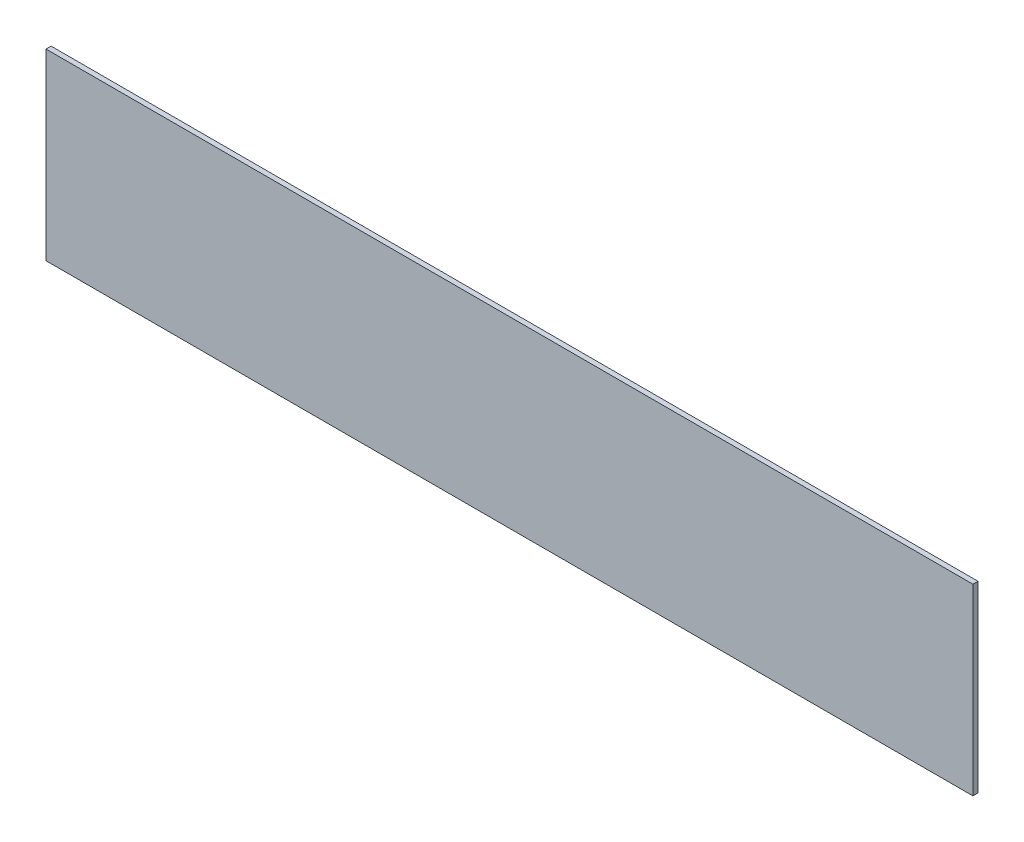
ISO-10303-21;
HEADER;
FILE_DESCRIPTION(('STEP AP214'),'2;1');
FILE_NAME('part.step','',(''),(''),'','','');
FILE_SCHEMA(('AUTOMOTIVE_DESIGN { 1 0 10303 214 1 1 1 1 }'));
ENDSEC;
DATA;
#1=APPLICATION_CONTEXT('core data for automotive mechanical design processes');
#2=APPLICATION_PROTOCOL_DEFINITION('international standard','automotive_design',2000,#1);
#3=PRODUCT_CONTEXT('',#1,'mechanical');
#4=PRODUCT('Part','Part','',(#3));
#5=PRODUCT_RELATED_PRODUCT_CATEGORY('part','',(#4));
#6=PRODUCT_DEFINITION_FORMATION('','',#4);
#7=PRODUCT_DEFINITION_CONTEXT('part definition',#1,'design');
#8=PRODUCT_DEFINITION('design','',#6,#7);
#9=PRODUCT_DEFINITION_SHAPE('','',#8);
#10=(LENGTH_UNIT() NAMED_UNIT(*) SI_UNIT(.MILLI.,.METRE.));
#11=(NAMED_UNIT(*) PLANE_ANGLE_UNIT() SI_UNIT($,.RADIAN.));
#12=(NAMED_UNIT(*) SI_UNIT($,.STERADIAN.) SOLID_ANGLE_UNIT());
#13=UNCERTAINTY_MEASURE_WITH_UNIT(LENGTH_MEASURE(1.E-05),#10,'distance_accuracy_value','');
#14=(GEOMETRIC_REPRESENTATION_CONTEXT(3) GLOBAL_UNCERTAINTY_ASSIGNED_CONTEXT((#13)) GLOBAL_UNIT_ASSIGNED_CONTEXT((#10,
#11,#12)) REPRESENTATION_CONTEXT('',''));
#15=CARTESIAN_POINT('',(0.,0.,0.));
#16=DIRECTION('',(0.,0.,1.));
#17=DIRECTION('',(1.,0.,0.));
#18=AXIS2_PLACEMENT_3D('',#15,#16,#17);
#19=CARTESIAN_POINT('',(259.,927.,27.));
#20=DIRECTION('',(1.,0.,0.));
#21=DIRECTION('',(0.,0.,-1.));
#22=AXIS2_PLACEMENT_3D('',#19,#20,#21);
#23=PLANE('',#22);
#24=DIRECTION('',(0.,-1.,0.));
#25=VECTOR('',#24,1.);
#26=CARTESIAN_POINT('',(259.,927.,26.));
#27=LINE('',#26,#25);
#28=CARTESIAN_POINT('',(259.,963.,26.));
#29=VERTEX_POINT('',#28);
#30=CARTESIAN_POINT('',(259.,927.,26.));
#31=VERTEX_POINT('',#30);
#32=EDGE_CURVE('E102',#29,#31,#27,.T.);
#33=ORIENTED_EDGE('',*,*,#32,.T.);
#34=DIRECTION('',(0.,0.,-1.));
#35=VECTOR('',#34,1.);
#36=CARTESIAN_POINT('',(259.,927.,27.));
#37=LINE('',#36,#35);
#38=CARTESIAN_POINT('',(259.,927.,27.));
#39=VERTEX_POINT('',#38);
#40=EDGE_CURVE('E11',#39,#31,#37,.T.);
#41=ORIENTED_EDGE('',*,*,#40,.F.);
#42=DIRECTION('',(0.,-1.,0.));
#43=VECTOR('',#42,1.);
#44=CARTESIAN_POINT('',(259.,927.,27.));
#45=LINE('',#44,#43);
#46=CARTESIAN_POINT('',(259.,963.,27.));
#47=VERTEX_POINT('',#46);
#48=EDGE_CURVE('E90',#47,#39,#45,.T.);
#49=ORIENTED_EDGE('',*,*,#48,.F.);
#50=DIRECTION('',(0.,0.,-1.));
#51=VECTOR('',#50,1.);
#52=CARTESIAN_POINT('',(259.,963.,27.));
#53=LINE('',#52,#51);
#54=EDGE_CURVE('E98',#47,#29,#53,.T.);
#55=ORIENTED_EDGE('',*,*,#54,.T.);
#56=EDGE_LOOP('',(#33,#41,#49,#55));
#57=FACE_BOUND('',#56,.T.);
#58=ADVANCED_FACE('F39',(#57),#23,.F.);
#59=CARTESIAN_POINT('',(259.,927.,27.));
#60=DIRECTION('',(0.,1.,0.));
#61=DIRECTION('',(0.,0.,1.));
#62=AXIS2_PLACEMENT_3D('',#59,#60,#61);
#63=PLANE('',#62);
#64=DIRECTION('',(1.,0.,0.));
#65=VECTOR('',#64,1.);
#66=CARTESIAN_POINT('',(259.,927.,26.));
#67=LINE('',#66,#65);
#68=CARTESIAN_POINT('',(441.,927.,26.));
#69=VERTEX_POINT('',#68);
#70=EDGE_CURVE('E94',#31,#69,#67,.T.);
#71=ORIENTED_EDGE('',*,*,#70,.T.);
#72=DIRECTION('',(0.,0.,-1.));
#73=VECTOR('',#72,1.);
#74=CARTESIAN_POINT('',(441.,927.,27.));
#75=LINE('',#74,#73);
#76=CARTESIAN_POINT('',(441.,927.,27.));
#77=VERTEX_POINT('',#76);
#78=EDGE_CURVE('E47',#77,#69,#75,.T.);
#79=ORIENTED_EDGE('',*,*,#78,.F.);
#80=DIRECTION('',(1.,0.,0.));
#81=VECTOR('',#80,1.);
#82=CARTESIAN_POINT('',(259.,927.,27.));
#83=LINE('',#82,#81);
#84=EDGE_CURVE('E85',#39,#77,#83,.T.);
#85=ORIENTED_EDGE('',*,*,#84,.F.);
#86=ORIENTED_EDGE('',*,*,#40,.T.);
#87=EDGE_LOOP('',(#71,#79,#85,#86));
#88=FACE_BOUND('',#87,.T.);
#89=ADVANCED_FACE('F93',(#88),#63,.F.);
#90=CARTESIAN_POINT('',(441.,927.,27.));
#91=DIRECTION('',(-1.,0.,0.));
#92=DIRECTION('',(0.,0.,1.));
#93=AXIS2_PLACEMENT_3D('',#90,#91,#92);
#94=PLANE('',#93);
#95=DIRECTION('',(0.,1.,0.));
#96=VECTOR('',#95,1.);
#97=CARTESIAN_POINT('',(441.,927.,26.));
#98=LINE('',#97,#96);
#99=CARTESIAN_POINT('',(441.,963.,26.));
#100=VERTEX_POINT('',#99);
#101=EDGE_CURVE('E72',#69,#100,#98,.T.);
#102=ORIENTED_EDGE('',*,*,#101,.T.);
#103=DIRECTION('',(0.,0.,-1.));
#104=VECTOR('',#103,1.);
#105=CARTESIAN_POINT('',(441.,963.,27.));
#106=LINE('',#105,#104);
#107=CARTESIAN_POINT('',(441.,963.,27.));
#108=VERTEX_POINT('',#107);
#109=EDGE_CURVE('E95',#108,#100,#106,.T.);
#110=ORIENTED_EDGE('',*,*,#109,.F.);
#111=DIRECTION('',(0.,1.,0.));
#112=VECTOR('',#111,1.);
#113=CARTESIAN_POINT('',(441.,927.,27.));
#114=LINE('',#113,#112);
#115=EDGE_CURVE('E88',#77,#108,#114,.T.);
#116=ORIENTED_EDGE('',*,*,#115,.F.);
#117=ORIENTED_EDGE('',*,*,#78,.T.);
#118=EDGE_LOOP('',(#102,#110,#116,#117));
#119=FACE_BOUND('',#118,.T.);
#120=ADVANCED_FACE('F96',(#119),#94,.F.);
#121=CARTESIAN_POINT('',(259.,963.,27.));
#122=DIRECTION('',(0.,-1.,0.));
#123=DIRECTION('',(0.,0.,-1.));
#124=AXIS2_PLACEMENT_3D('',#121,#122,#123);
#125=PLANE('',#124);
#126=DIRECTION('',(-1.,0.,0.));
#127=VECTOR('',#126,1.);
#128=CARTESIAN_POINT('',(259.,963.,26.));
#129=LINE('',#128,#127);
#130=EDGE_CURVE('E78',#100,#29,#129,.T.);
#131=ORIENTED_EDGE('',*,*,#130,.T.);
#132=ORIENTED_EDGE('',*,*,#54,.F.);
#133=DIRECTION('',(-1.,0.,0.));
#134=VECTOR('',#133,1.);
#135=CARTESIAN_POINT('',(259.,963.,27.));
#136=LINE('',#135,#134);
#137=EDGE_CURVE('E55',#108,#47,#136,.T.);
#138=ORIENTED_EDGE('',*,*,#137,.F.);
#139=ORIENTED_EDGE('',*,*,#109,.T.);
#140=EDGE_LOOP('',(#131,#132,#138,#139));
#141=FACE_BOUND('',#140,.T.);
#142=ADVANCED_FACE('F109',(#141),#125,.F.);
#143=CARTESIAN_POINT('',(0.,0.,27.));
#144=DIRECTION('',(0.,0.,-1.));
#145=DIRECTION('',(-1.,0.,0.));
#146=AXIS2_PLACEMENT_3D('',#143,#144,#145);
#147=PLANE('',#146);
#148=ORIENTED_EDGE('',*,*,#48,.T.);
#149=ORIENTED_EDGE('',*,*,#84,.T.);
#150=ORIENTED_EDGE('',*,*,#115,.T.);
#151=ORIENTED_EDGE('',*,*,#137,.T.);
#152=EDGE_LOOP('',(#148,#149,#150,#151));
#153=FACE_BOUND('',#152,.T.);
#154=ADVANCED_FACE('F86',(#153),#147,.F.);
#155=CARTESIAN_POINT('',(0.,0.,26.));
#156=DIRECTION('',(0.,0.,-1.));
#157=DIRECTION('',(-1.,0.,0.));
#158=AXIS2_PLACEMENT_3D('',#155,#156,#157);
#159=PLANE('',#158);
#160=ORIENTED_EDGE('',*,*,#32,.F.);
#161=ORIENTED_EDGE('',*,*,#130,.F.);
#162=ORIENTED_EDGE('',*,*,#101,.F.);
#163=ORIENTED_EDGE('',*,*,#70,.F.);
#164=EDGE_LOOP('',(#160,#161,#162,#163));
#165=FACE_BOUND('',#164,.T.);
#166=ADVANCED_FACE('F112',(#165),#159,.T.);
#167=CLOSED_SHELL('',(#58,#89,#120,#142,#154,#166));
#168=MANIFOLD_SOLID_BREP('B2',#167);
#169=ADVANCED_BREP_SHAPE_REPRESENTATION('',(#18,#168),#14);
#170=SHAPE_DEFINITION_REPRESENTATION(#9,#169);
ENDSEC;
END-ISO-10303-21;
